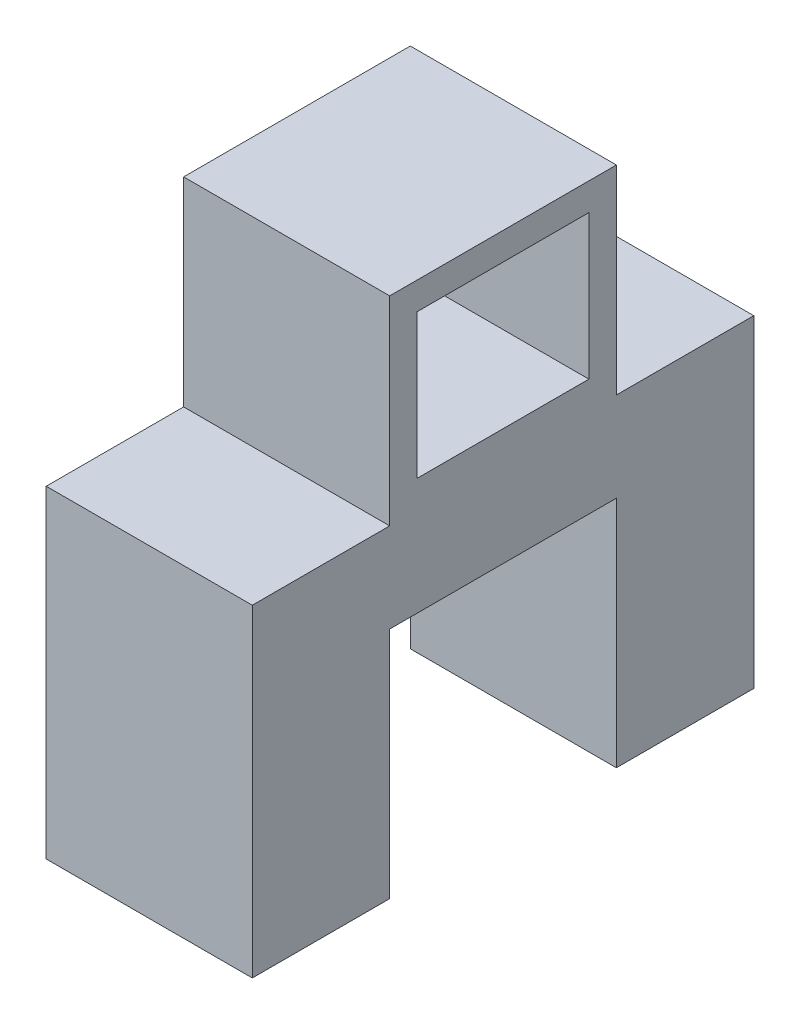
ISO-10303-21;
HEADER;
FILE_DESCRIPTION(('STEP AP214'),'2;1');
FILE_NAME('part.step','',(''),(''),'','','');
FILE_SCHEMA(('AUTOMOTIVE_DESIGN { 1 0 10303 214 1 1 1 1 }'));
ENDSEC;
DATA;
#1=APPLICATION_CONTEXT('core data for automotive mechanical design processes');
#2=APPLICATION_PROTOCOL_DEFINITION('international standard','automotive_design',2000,#1);
#3=PRODUCT_CONTEXT('',#1,'mechanical');
#4=PRODUCT('Part','Part','',(#3));
#5=PRODUCT_RELATED_PRODUCT_CATEGORY('part','',(#4));
#6=PRODUCT_DEFINITION_FORMATION('','',#4);
#7=PRODUCT_DEFINITION_CONTEXT('part definition',#1,'design');
#8=PRODUCT_DEFINITION('design','',#6,#7);
#9=PRODUCT_DEFINITION_SHAPE('','',#8);
#10=(LENGTH_UNIT() NAMED_UNIT(*) SI_UNIT(.MILLI.,.METRE.));
#11=(NAMED_UNIT(*) PLANE_ANGLE_UNIT() SI_UNIT($,.RADIAN.));
#12=(NAMED_UNIT(*) SI_UNIT($,.STERADIAN.) SOLID_ANGLE_UNIT());
#13=UNCERTAINTY_MEASURE_WITH_UNIT(LENGTH_MEASURE(1.E-05),#10,'distance_accuracy_value','');
#14=(GEOMETRIC_REPRESENTATION_CONTEXT(3) GLOBAL_UNCERTAINTY_ASSIGNED_CONTEXT((#13)) GLOBAL_UNIT_ASSIGNED_CONTEXT((#10,
#11,#12)) REPRESENTATION_CONTEXT('',''));
#15=CARTESIAN_POINT('',(0.,0.,0.));
#16=DIRECTION('',(0.,0.,1.));
#17=DIRECTION('',(1.,0.,0.));
#18=AXIS2_PLACEMENT_3D('',#15,#16,#17);
#19=CARTESIAN_POINT('',(15.,0.,0.));
#20=DIRECTION('',(-1.,0.,0.));
#21=DIRECTION('',(0.,0.,1.));
#22=AXIS2_PLACEMENT_3D('',#19,#20,#21);
#23=PLANE('',#22);
#24=DIRECTION('',(0.,0.,1.));
#25=VECTOR('',#24,1.);
#26=CARTESIAN_POINT('',(15.,2.,2.));
#27=LINE('',#26,#25);
#28=CARTESIAN_POINT('',(15.,2.,-14.5));
#29=VERTEX_POINT('',#28);
#30=CARTESIAN_POINT('',(15.,2.,2.));
#31=VERTEX_POINT('',#30);
#32=EDGE_CURVE('E201',#29,#31,#27,.T.);
#33=ORIENTED_EDGE('',*,*,#32,.T.);
#34=DIRECTION('',(0.,-1.,0.));
#35=VECTOR('',#34,1.);
#36=CARTESIAN_POINT('',(15.,2.,2.));
#37=LINE('',#36,#35);
#38=CARTESIAN_POINT('',(15.,-12.5,2.));
#39=VERTEX_POINT('',#38);
#40=EDGE_CURVE('E205',#31,#39,#37,.T.);
#41=ORIENTED_EDGE('',*,*,#40,.T.);
#42=DIRECTION('',(0.,0.,1.));
#43=VECTOR('',#42,1.);
#44=CARTESIAN_POINT('',(15.,-12.5,2.));
#45=LINE('',#44,#43);
#46=CARTESIAN_POINT('',(15.,-12.5,12.));
#47=VERTEX_POINT('',#46);
#48=EDGE_CURVE('E209',#39,#47,#45,.T.);
#49=ORIENTED_EDGE('',*,*,#48,.T.);
#50=DIRECTION('',(0.,-1.,0.));
#51=VECTOR('',#50,1.);
#52=CARTESIAN_POINT('',(15.,-12.5,12.));
#53=LINE('',#52,#51);
#54=CARTESIAN_POINT('',(15.,-36.,12.));
#55=VERTEX_POINT('',#54);
#56=EDGE_CURVE('E212',#47,#55,#53,.T.);
#57=ORIENTED_EDGE('',*,*,#56,.T.);
#58=DIRECTION('',(0.,0.,-1.));
#59=VECTOR('',#58,1.);
#60=CARTESIAN_POINT('',(15.,-36.,12.));
#61=LINE('',#60,#59);
#62=CARTESIAN_POINT('',(15.,-36.,2.));
#63=VERTEX_POINT('',#62);
#64=EDGE_CURVE('E215',#55,#63,#61,.T.);
#65=ORIENTED_EDGE('',*,*,#64,.T.);
#66=DIRECTION('',(0.,1.,0.));
#67=VECTOR('',#66,1.);
#68=CARTESIAN_POINT('',(15.,-36.,2.));
#69=LINE('',#68,#67);
#70=CARTESIAN_POINT('',(15.,-19.0033817942634,2.));
#71=VERTEX_POINT('',#70);
#72=EDGE_CURVE('E218',#63,#71,#69,.T.);
#73=ORIENTED_EDGE('',*,*,#72,.T.);
#74=DIRECTION('',(0.,0.,-1.));
#75=VECTOR('',#74,1.);
#76=CARTESIAN_POINT('',(15.,-19.0033817942634,2.));
#77=LINE('',#76,#75);
#78=CARTESIAN_POINT('',(15.,-19.0033817942634,-14.5));
#79=VERTEX_POINT('',#78);
#80=EDGE_CURVE('E221',#71,#79,#77,.T.);
#81=ORIENTED_EDGE('',*,*,#80,.T.);
#82=DIRECTION('',(0.,-1.,0.));
#83=VECTOR('',#82,1.);
#84=CARTESIAN_POINT('',(15.,-19.0033817942634,-14.5));
#85=LINE('',#84,#83);
#86=CARTESIAN_POINT('',(15.,-36.,-14.5));
#87=VERTEX_POINT('',#86);
#88=EDGE_CURVE('E224',#79,#87,#85,.T.);
#89=ORIENTED_EDGE('',*,*,#88,.T.);
#90=DIRECTION('',(0.,0.,-1.));
#91=VECTOR('',#90,1.);
#92=CARTESIAN_POINT('',(15.,-36.,-14.5));
#93=LINE('',#92,#91);
#94=CARTESIAN_POINT('',(15.,-36.,-24.5));
#95=VERTEX_POINT('',#94);
#96=EDGE_CURVE('E227',#87,#95,#93,.T.);
#97=ORIENTED_EDGE('',*,*,#96,.T.);
#98=DIRECTION('',(0.,1.,0.));
#99=VECTOR('',#98,1.);
#100=CARTESIAN_POINT('',(15.,-12.5,-24.5));
#101=LINE('',#100,#99);
#102=CARTESIAN_POINT('',(15.,-12.5,-24.5));
#103=VERTEX_POINT('',#102);
#104=EDGE_CURVE('E230',#95,#103,#101,.T.);
#105=ORIENTED_EDGE('',*,*,#104,.T.);
#106=DIRECTION('',(0.,0.,1.));
#107=VECTOR('',#106,1.);
#108=CARTESIAN_POINT('',(15.,-12.5,-14.5));
#109=LINE('',#108,#107);
#110=CARTESIAN_POINT('',(15.,-12.5,-14.5));
#111=VERTEX_POINT('',#110);
#112=EDGE_CURVE('E233',#103,#111,#109,.T.);
#113=ORIENTED_EDGE('',*,*,#112,.T.);
#114=DIRECTION('',(0.,1.,0.));
#115=VECTOR('',#114,1.);
#116=CARTESIAN_POINT('',(15.,2.,-14.5));
#117=LINE('',#116,#115);
#118=EDGE_CURVE('E236',#111,#29,#117,.T.);
#119=ORIENTED_EDGE('',*,*,#118,.T.);
#120=EDGE_LOOP('',(#33,#41,#49,#57,#65,#73,#81,#89,#97,#105,#113,#119));
#121=FACE_BOUND('',#120,.T.);
#122=DIRECTION('',(0.,-1.,0.));
#123=VECTOR('',#122,1.);
#124=CARTESIAN_POINT('',(15.,0.,0.));
#125=LINE('',#124,#123);
#126=CARTESIAN_POINT('',(15.,0.,0.));
#127=VERTEX_POINT('',#126);
#128=CARTESIAN_POINT('',(15.,-10.5,0.));
#129=VERTEX_POINT('',#128);
#130=EDGE_CURVE('E153',#127,#129,#125,.T.);
#131=ORIENTED_EDGE('',*,*,#130,.F.);
#132=DIRECTION('',(0.,0.,1.));
#133=VECTOR('',#132,1.);
#134=CARTESIAN_POINT('',(15.,0.,0.));
#135=LINE('',#134,#133);
#136=CARTESIAN_POINT('',(15.,0.,-12.5));
#137=VERTEX_POINT('',#136);
#138=EDGE_CURVE('E179',#137,#127,#135,.T.);
#139=ORIENTED_EDGE('',*,*,#138,.F.);
#140=DIRECTION('',(0.,1.,0.));
#141=VECTOR('',#140,1.);
#142=CARTESIAN_POINT('',(15.,0.,-12.5));
#143=LINE('',#142,#141);
#144=CARTESIAN_POINT('',(15.,-10.5,-12.5));
#145=VERTEX_POINT('',#144);
#146=EDGE_CURVE('E175',#145,#137,#143,.T.);
#147=ORIENTED_EDGE('',*,*,#146,.F.);
#148=DIRECTION('',(0.,0.,-1.));
#149=VECTOR('',#148,1.);
#150=CARTESIAN_POINT('',(15.,-10.5,0.));
#151=LINE('',#150,#149);
#152=EDGE_CURVE('E162',#129,#145,#151,.T.);
#153=ORIENTED_EDGE('',*,*,#152,.F.);
#154=EDGE_LOOP('',(#131,#139,#147,#153));
#155=FACE_BOUND('',#154,.T.);
#156=ADVANCED_FACE('F39',(#121,#155),#23,.F.);
#157=CARTESIAN_POINT('',(0.,0.,0.));
#158=DIRECTION('',(-1.,0.,0.));
#159=DIRECTION('',(0.,0.,1.));
#160=AXIS2_PLACEMENT_3D('',#157,#158,#159);
#161=PLANE('',#160);
#162=DIRECTION('',(0.,0.,1.));
#163=VECTOR('',#162,1.);
#164=CARTESIAN_POINT('',(0.,2.,2.));
#165=LINE('',#164,#163);
#166=CARTESIAN_POINT('',(0.,2.,-14.5));
#167=VERTEX_POINT('',#166);
#168=CARTESIAN_POINT('',(0.,2.,2.));
#169=VERTEX_POINT('',#168);
#170=EDGE_CURVE('E171',#167,#169,#165,.T.);
#171=ORIENTED_EDGE('',*,*,#170,.F.);
#172=DIRECTION('',(0.,1.,0.));
#173=VECTOR('',#172,1.);
#174=CARTESIAN_POINT('',(0.,2.,-14.5));
#175=LINE('',#174,#173);
#176=CARTESIAN_POINT('',(0.,-12.5,-14.5));
#177=VERTEX_POINT('',#176);
#178=EDGE_CURVE('E206',#177,#167,#175,.T.);
#179=ORIENTED_EDGE('',*,*,#178,.F.);
#180=DIRECTION('',(0.,0.,1.));
#181=VECTOR('',#180,1.);
#182=CARTESIAN_POINT('',(0.,-12.5,-14.5));
#183=LINE('',#182,#181);
#184=CARTESIAN_POINT('',(0.,-12.5,-24.5));
#185=VERTEX_POINT('',#184);
#186=EDGE_CURVE('E270',#185,#177,#183,.T.);
#187=ORIENTED_EDGE('',*,*,#186,.F.);
#188=DIRECTION('',(0.,1.,0.));
#189=VECTOR('',#188,1.);
#190=CARTESIAN_POINT('',(0.,-12.5,-24.5));
#191=LINE('',#190,#189);
#192=CARTESIAN_POINT('',(0.,-36.,-24.5));
#193=VERTEX_POINT('',#192);
#194=EDGE_CURVE('E267',#193,#185,#191,.T.);
#195=ORIENTED_EDGE('',*,*,#194,.F.);
#196=DIRECTION('',(0.,0.,-1.));
#197=VECTOR('',#196,1.);
#198=CARTESIAN_POINT('',(0.,-36.,-14.5));
#199=LINE('',#198,#197);
#200=CARTESIAN_POINT('',(0.,-36.,-14.5));
#201=VERTEX_POINT('',#200);
#202=EDGE_CURVE('E264',#201,#193,#199,.T.);
#203=ORIENTED_EDGE('',*,*,#202,.F.);
#204=DIRECTION('',(0.,-1.,0.));
#205=VECTOR('',#204,1.);
#206=CARTESIAN_POINT('',(0.,-19.0033817942634,-14.5));
#207=LINE('',#206,#205);
#208=CARTESIAN_POINT('',(0.,-19.0033817942634,-14.5));
#209=VERTEX_POINT('',#208);
#210=EDGE_CURVE('E261',#209,#201,#207,.T.);
#211=ORIENTED_EDGE('',*,*,#210,.F.);
#212=DIRECTION('',(0.,0.,-1.));
#213=VECTOR('',#212,1.);
#214=CARTESIAN_POINT('',(0.,-19.0033817942634,2.));
#215=LINE('',#214,#213);
#216=CARTESIAN_POINT('',(0.,-19.0033817942634,2.));
#217=VERTEX_POINT('',#216);
#218=EDGE_CURVE('E258',#217,#209,#215,.T.);
#219=ORIENTED_EDGE('',*,*,#218,.F.);
#220=DIRECTION('',(0.,1.,0.));
#221=VECTOR('',#220,1.);
#222=CARTESIAN_POINT('',(0.,-36.,2.));
#223=LINE('',#222,#221);
#224=CARTESIAN_POINT('',(0.,-36.,2.));
#225=VERTEX_POINT('',#224);
#226=EDGE_CURVE('E255',#225,#217,#223,.T.);
#227=ORIENTED_EDGE('',*,*,#226,.F.);
#228=DIRECTION('',(0.,0.,-1.));
#229=VECTOR('',#228,1.);
#230=CARTESIAN_POINT('',(0.,-36.,12.));
#231=LINE('',#230,#229);
#232=CARTESIAN_POINT('',(0.,-36.,12.));
#233=VERTEX_POINT('',#232);
#234=EDGE_CURVE('E252',#233,#225,#231,.T.);
#235=ORIENTED_EDGE('',*,*,#234,.F.);
#236=DIRECTION('',(0.,-1.,0.));
#237=VECTOR('',#236,1.);
#238=CARTESIAN_POINT('',(0.,-12.5,12.));
#239=LINE('',#238,#237);
#240=CARTESIAN_POINT('',(0.,-12.5,12.));
#241=VERTEX_POINT('',#240);
#242=EDGE_CURVE('E249',#241,#233,#239,.T.);
#243=ORIENTED_EDGE('',*,*,#242,.F.);
#244=DIRECTION('',(0.,0.,1.));
#245=VECTOR('',#244,1.);
#246=CARTESIAN_POINT('',(0.,-12.5,2.));
#247=LINE('',#246,#245);
#248=CARTESIAN_POINT('',(0.,-12.5,2.));
#249=VERTEX_POINT('',#248);
#250=EDGE_CURVE('E246',#249,#241,#247,.T.);
#251=ORIENTED_EDGE('',*,*,#250,.F.);
#252=DIRECTION('',(0.,-1.,0.));
#253=VECTOR('',#252,1.);
#254=CARTESIAN_POINT('',(0.,2.,2.));
#255=LINE('',#254,#253);
#256=EDGE_CURVE('E243',#169,#249,#255,.T.);
#257=ORIENTED_EDGE('',*,*,#256,.F.);
#258=EDGE_LOOP('',(#171,#179,#187,#195,#203,#211,#219,#227,#235,#243,#251,#257));
#259=FACE_BOUND('',#258,.T.);
#260=DIRECTION('',(0.,0.,1.));
#261=VECTOR('',#260,1.);
#262=CARTESIAN_POINT('',(0.,0.,0.));
#263=LINE('',#262,#261);
#264=CARTESIAN_POINT('',(0.,0.,-12.5));
#265=VERTEX_POINT('',#264);
#266=CARTESIAN_POINT('',(0.,0.,0.));
#267=VERTEX_POINT('',#266);
#268=EDGE_CURVE('E163',#265,#267,#263,.T.);
#269=ORIENTED_EDGE('',*,*,#268,.T.);
#270=DIRECTION('',(0.,-1.,0.));
#271=VECTOR('',#270,1.);
#272=CARTESIAN_POINT('',(0.,0.,0.));
#273=LINE('',#272,#271);
#274=CARTESIAN_POINT('',(0.,-10.5,0.));
#275=VERTEX_POINT('',#274);
#276=EDGE_CURVE('E63',#267,#275,#273,.T.);
#277=ORIENTED_EDGE('',*,*,#276,.T.);
#278=DIRECTION('',(0.,0.,-1.));
#279=VECTOR('',#278,1.);
#280=CARTESIAN_POINT('',(0.,-10.5,0.));
#281=LINE('',#280,#279);
#282=CARTESIAN_POINT('',(0.,-10.5,-12.5));
#283=VERTEX_POINT('',#282);
#284=EDGE_CURVE('E169',#275,#283,#281,.T.);
#285=ORIENTED_EDGE('',*,*,#284,.T.);
#286=DIRECTION('',(0.,1.,0.));
#287=VECTOR('',#286,1.);
#288=CARTESIAN_POINT('',(0.,0.,-12.5));
#289=LINE('',#288,#287);
#290=EDGE_CURVE('E188',#283,#265,#289,.T.);
#291=ORIENTED_EDGE('',*,*,#290,.T.);
#292=EDGE_LOOP('',(#269,#277,#285,#291));
#293=FACE_BOUND('',#292,.T.);
#294=ADVANCED_FACE('F325',(#259,#293),#161,.T.);
#295=CARTESIAN_POINT('',(15.,2.,2.));
#296=DIRECTION('',(0.,-1.,0.));
#297=DIRECTION('',(0.,0.,-1.));
#298=AXIS2_PLACEMENT_3D('',#295,#296,#297);
#299=PLANE('',#298);
#300=ORIENTED_EDGE('',*,*,#170,.T.);
#301=DIRECTION('',(-1.,0.,0.));
#302=VECTOR('',#301,1.);
#303=CARTESIAN_POINT('',(15.,2.,2.));
#304=LINE('',#303,#302);
#305=EDGE_CURVE('E11',#31,#169,#304,.T.);
#306=ORIENTED_EDGE('',*,*,#305,.F.);
#307=ORIENTED_EDGE('',*,*,#32,.F.);
#308=DIRECTION('',(-1.,0.,0.));
#309=VECTOR('',#308,1.);
#310=CARTESIAN_POINT('',(15.,2.,-14.5));
#311=LINE('',#310,#309);
#312=EDGE_CURVE('E239',#29,#167,#311,.T.);
#313=ORIENTED_EDGE('',*,*,#312,.T.);
#314=EDGE_LOOP('',(#300,#306,#307,#313));
#315=FACE_BOUND('',#314,.T.);
#316=ADVANCED_FACE('F41',(#315),#299,.F.);
#317=CARTESIAN_POINT('',(15.,2.,2.));
#318=DIRECTION('',(0.,0.,-1.));
#319=DIRECTION('',(-1.,0.,0.));
#320=AXIS2_PLACEMENT_3D('',#317,#318,#319);
#321=PLANE('',#320);
#322=ORIENTED_EDGE('',*,*,#256,.T.);
#323=DIRECTION('',(-1.,0.,0.));
#324=VECTOR('',#323,1.);
#325=CARTESIAN_POINT('',(15.,-12.5,2.));
#326=LINE('',#325,#324);
#327=EDGE_CURVE('E48',#39,#249,#326,.T.);
#328=ORIENTED_EDGE('',*,*,#327,.F.);
#329=ORIENTED_EDGE('',*,*,#40,.F.);
#330=ORIENTED_EDGE('',*,*,#305,.T.);
#331=EDGE_LOOP('',(#322,#328,#329,#330));
#332=FACE_BOUND('',#331,.T.);
#333=ADVANCED_FACE('F342',(#332),#321,.F.);
#334=CARTESIAN_POINT('',(15.,-12.5,2.));
#335=DIRECTION('',(0.,-1.,0.));
#336=DIRECTION('',(0.,0.,-1.));
#337=AXIS2_PLACEMENT_3D('',#334,#335,#336);
#338=PLANE('',#337);
#339=ORIENTED_EDGE('',*,*,#250,.T.);
#340=DIRECTION('',(-1.,0.,0.));
#341=VECTOR('',#340,1.);
#342=CARTESIAN_POINT('',(15.,-12.5,12.));
#343=LINE('',#342,#341);
#344=EDGE_CURVE('E310',#47,#241,#343,.T.);
#345=ORIENTED_EDGE('',*,*,#344,.F.);
#346=ORIENTED_EDGE('',*,*,#48,.F.);
#347=ORIENTED_EDGE('',*,*,#327,.T.);
#348=EDGE_LOOP('',(#339,#345,#346,#347));
#349=FACE_BOUND('',#348,.T.);
#350=ADVANCED_FACE('F319',(#349),#338,.F.);
#351=CARTESIAN_POINT('',(15.,-12.5,12.));
#352=DIRECTION('',(0.,0.,-1.));
#353=DIRECTION('',(0.,1.,0.));
#354=AXIS2_PLACEMENT_3D('',#351,#352,#353);
#355=PLANE('',#354);
#356=ORIENTED_EDGE('',*,*,#242,.T.);
#357=DIRECTION('',(-1.,0.,0.));
#358=VECTOR('',#357,1.);
#359=CARTESIAN_POINT('',(15.,-36.,12.));
#360=LINE('',#359,#358);
#361=EDGE_CURVE('E306',#55,#233,#360,.T.);
#362=ORIENTED_EDGE('',*,*,#361,.F.);
#363=ORIENTED_EDGE('',*,*,#56,.F.);
#364=ORIENTED_EDGE('',*,*,#344,.T.);
#365=EDGE_LOOP('',(#356,#362,#363,#364));
#366=FACE_BOUND('',#365,.T.);
#367=ADVANCED_FACE('F331',(#366),#355,.F.);
#368=CARTESIAN_POINT('',(15.,-36.,12.));
#369=DIRECTION('',(0.,1.,0.));
#370=DIRECTION('',(0.,0.,1.));
#371=AXIS2_PLACEMENT_3D('',#368,#369,#370);
#372=PLANE('',#371);
#373=ORIENTED_EDGE('',*,*,#234,.T.);
#374=DIRECTION('',(-1.,0.,0.));
#375=VECTOR('',#374,1.);
#376=CARTESIAN_POINT('',(15.,-36.,2.));
#377=LINE('',#376,#375);
#378=EDGE_CURVE('E302',#63,#225,#377,.T.);
#379=ORIENTED_EDGE('',*,*,#378,.F.);
#380=ORIENTED_EDGE('',*,*,#64,.F.);
#381=ORIENTED_EDGE('',*,*,#361,.T.);
#382=EDGE_LOOP('',(#373,#379,#380,#381));
#383=FACE_BOUND('',#382,.T.);
#384=ADVANCED_FACE('F335',(#383),#372,.F.);
#385=CARTESIAN_POINT('',(15.,-36.,2.));
#386=DIRECTION('',(0.,0.,1.));
#387=DIRECTION('',(0.,-1.,0.));
#388=AXIS2_PLACEMENT_3D('',#385,#386,#387);
#389=PLANE('',#388);
#390=ORIENTED_EDGE('',*,*,#226,.T.);
#391=DIRECTION('',(-1.,0.,0.));
#392=VECTOR('',#391,1.);
#393=CARTESIAN_POINT('',(15.,-19.0033817942634,2.));
#394=LINE('',#393,#392);
#395=EDGE_CURVE('E298',#71,#217,#394,.T.);
#396=ORIENTED_EDGE('',*,*,#395,.F.);
#397=ORIENTED_EDGE('',*,*,#72,.F.);
#398=ORIENTED_EDGE('',*,*,#378,.T.);
#399=EDGE_LOOP('',(#390,#396,#397,#398));
#400=FACE_BOUND('',#399,.T.);
#401=ADVANCED_FACE('F375',(#400),#389,.F.);
#402=CARTESIAN_POINT('',(15.,-19.0033817942634,2.));
#403=DIRECTION('',(0.,1.,0.));
#404=DIRECTION('',(0.,0.,1.));
#405=AXIS2_PLACEMENT_3D('',#402,#403,#404);
#406=PLANE('',#405);
#407=ORIENTED_EDGE('',*,*,#218,.T.);
#408=DIRECTION('',(-1.,0.,0.));
#409=VECTOR('',#408,1.);
#410=CARTESIAN_POINT('',(15.,-19.0033817942634,-14.5));
#411=LINE('',#410,#409);
#412=EDGE_CURVE('E294',#79,#209,#411,.T.);
#413=ORIENTED_EDGE('',*,*,#412,.F.);
#414=ORIENTED_EDGE('',*,*,#80,.F.);
#415=ORIENTED_EDGE('',*,*,#395,.T.);
#416=EDGE_LOOP('',(#407,#413,#414,#415));
#417=FACE_BOUND('',#416,.T.);
#418=ADVANCED_FACE('F373',(#417),#406,.F.);
#419=CARTESIAN_POINT('',(15.,-19.0033817942634,-14.5));
#420=DIRECTION('',(0.,0.,-1.));
#421=DIRECTION('',(-1.,0.,0.));
#422=AXIS2_PLACEMENT_3D('',#419,#420,#421);
#423=PLANE('',#422);
#424=ORIENTED_EDGE('',*,*,#210,.T.);
#425=DIRECTION('',(-1.,0.,0.));
#426=VECTOR('',#425,1.);
#427=CARTESIAN_POINT('',(15.,-36.,-14.5));
#428=LINE('',#427,#426);
#429=EDGE_CURVE('E290',#87,#201,#428,.T.);
#430=ORIENTED_EDGE('',*,*,#429,.F.);
#431=ORIENTED_EDGE('',*,*,#88,.F.);
#432=ORIENTED_EDGE('',*,*,#412,.T.);
#433=EDGE_LOOP('',(#424,#430,#431,#432));
#434=FACE_BOUND('',#433,.T.);
#435=ADVANCED_FACE('F369',(#434),#423,.F.);
#436=CARTESIAN_POINT('',(15.,-36.,-14.5));
#437=DIRECTION('',(0.,1.,0.));
#438=DIRECTION('',(0.,0.,1.));
#439=AXIS2_PLACEMENT_3D('',#436,#437,#438);
#440=PLANE('',#439);
#441=ORIENTED_EDGE('',*,*,#202,.T.);
#442=DIRECTION('',(-1.,0.,0.));
#443=VECTOR('',#442,1.);
#444=CARTESIAN_POINT('',(15.,-36.,-24.5));
#445=LINE('',#444,#443);
#446=EDGE_CURVE('E286',#95,#193,#445,.T.);
#447=ORIENTED_EDGE('',*,*,#446,.F.);
#448=ORIENTED_EDGE('',*,*,#96,.F.);
#449=ORIENTED_EDGE('',*,*,#429,.T.);
#450=EDGE_LOOP('',(#441,#447,#448,#449));
#451=FACE_BOUND('',#450,.T.);
#452=ADVANCED_FACE('F364',(#451),#440,.F.);
#453=CARTESIAN_POINT('',(15.,-12.5,-24.5));
#454=DIRECTION('',(0.,0.,1.));
#455=DIRECTION('',(1.,0.,0.));
#456=AXIS2_PLACEMENT_3D('',#453,#454,#455);
#457=PLANE('',#456);
#458=ORIENTED_EDGE('',*,*,#194,.T.);
#459=DIRECTION('',(-1.,0.,0.));
#460=VECTOR('',#459,1.);
#461=CARTESIAN_POINT('',(15.,-12.5,-24.5));
#462=LINE('',#461,#460);
#463=EDGE_CURVE('E282',#103,#185,#462,.T.);
#464=ORIENTED_EDGE('',*,*,#463,.F.);
#465=ORIENTED_EDGE('',*,*,#104,.F.);
#466=ORIENTED_EDGE('',*,*,#446,.T.);
#467=EDGE_LOOP('',(#458,#464,#465,#466));
#468=FACE_BOUND('',#467,.T.);
#469=ADVANCED_FACE('F358',(#468),#457,.F.);
#470=CARTESIAN_POINT('',(15.,-12.5,-14.5));
#471=DIRECTION('',(0.,-1.,0.));
#472=DIRECTION('',(0.,0.,-1.));
#473=AXIS2_PLACEMENT_3D('',#470,#471,#472);
#474=PLANE('',#473);
#475=ORIENTED_EDGE('',*,*,#186,.T.);
#476=DIRECTION('',(-1.,0.,0.));
#477=VECTOR('',#476,1.);
#478=CARTESIAN_POINT('',(15.,-12.5,-14.5));
#479=LINE('',#478,#477);
#480=EDGE_CURVE('E278',#111,#177,#479,.T.);
#481=ORIENTED_EDGE('',*,*,#480,.F.);
#482=ORIENTED_EDGE('',*,*,#112,.F.);
#483=ORIENTED_EDGE('',*,*,#463,.T.);
#484=EDGE_LOOP('',(#475,#481,#482,#483));
#485=FACE_BOUND('',#484,.T.);
#486=ADVANCED_FACE('F354',(#485),#474,.F.);
#487=CARTESIAN_POINT('',(15.,2.,-14.5));
#488=DIRECTION('',(0.,0.,1.));
#489=DIRECTION('',(1.,0.,0.));
#490=AXIS2_PLACEMENT_3D('',#487,#488,#489);
#491=PLANE('',#490);
#492=ORIENTED_EDGE('',*,*,#178,.T.);
#493=ORIENTED_EDGE('',*,*,#312,.F.);
#494=ORIENTED_EDGE('',*,*,#118,.F.);
#495=ORIENTED_EDGE('',*,*,#480,.T.);
#496=EDGE_LOOP('',(#492,#493,#494,#495));
#497=FACE_BOUND('',#496,.T.);
#498=ADVANCED_FACE('F349',(#497),#491,.F.);
#499=CARTESIAN_POINT('',(15.,0.,0.));
#500=DIRECTION('',(0.,0.,-1.));
#501=DIRECTION('',(0.,1.,0.));
#502=AXIS2_PLACEMENT_3D('',#499,#500,#501);
#503=PLANE('',#502);
#504=ORIENTED_EDGE('',*,*,#276,.F.);
#505=DIRECTION('',(-1.,0.,0.));
#506=VECTOR('',#505,1.);
#507=CARTESIAN_POINT('',(15.,0.,0.));
#508=LINE('',#507,#506);
#509=EDGE_CURVE('E157',#127,#267,#508,.T.);
#510=ORIENTED_EDGE('',*,*,#509,.F.);
#511=ORIENTED_EDGE('',*,*,#130,.T.);
#512=DIRECTION('',(-1.,0.,0.));
#513=VECTOR('',#512,1.);
#514=CARTESIAN_POINT('',(15.,-10.5,0.));
#515=LINE('',#514,#513);
#516=EDGE_CURVE('E156',#129,#275,#515,.T.);
#517=ORIENTED_EDGE('',*,*,#516,.T.);
#518=EDGE_LOOP('',(#504,#510,#511,#517));
#519=FACE_BOUND('',#518,.T.);
#520=ADVANCED_FACE('F155',(#519),#503,.T.);
#521=CARTESIAN_POINT('',(15.,-10.5,0.));
#522=DIRECTION('',(0.,1.,0.));
#523=DIRECTION('',(0.,0.,1.));
#524=AXIS2_PLACEMENT_3D('',#521,#522,#523);
#525=PLANE('',#524);
#526=ORIENTED_EDGE('',*,*,#284,.F.);
#527=ORIENTED_EDGE('',*,*,#516,.F.);
#528=ORIENTED_EDGE('',*,*,#152,.T.);
#529=DIRECTION('',(-1.,0.,0.));
#530=VECTOR('',#529,1.);
#531=CARTESIAN_POINT('',(15.,-10.5,-12.5));
#532=LINE('',#531,#530);
#533=EDGE_CURVE('E172',#145,#283,#532,.T.);
#534=ORIENTED_EDGE('',*,*,#533,.T.);
#535=EDGE_LOOP('',(#526,#527,#528,#534));
#536=FACE_BOUND('',#535,.T.);
#537=ADVANCED_FACE('F166',(#536),#525,.T.);
#538=CARTESIAN_POINT('',(15.,0.,-12.5));
#539=DIRECTION('',(0.,0.,1.));
#540=DIRECTION('',(0.,-1.,0.));
#541=AXIS2_PLACEMENT_3D('',#538,#539,#540);
#542=PLANE('',#541);
#543=ORIENTED_EDGE('',*,*,#290,.F.);
#544=ORIENTED_EDGE('',*,*,#533,.F.);
#545=ORIENTED_EDGE('',*,*,#146,.T.);
#546=DIRECTION('',(-1.,0.,0.));
#547=VECTOR('',#546,1.);
#548=CARTESIAN_POINT('',(15.,0.,-12.5));
#549=LINE('',#548,#547);
#550=EDGE_CURVE('E55',#137,#265,#549,.T.);
#551=ORIENTED_EDGE('',*,*,#550,.T.);
#552=EDGE_LOOP('',(#543,#544,#545,#551));
#553=FACE_BOUND('',#552,.T.);
#554=ADVANCED_FACE('F433',(#553),#542,.T.);
#555=CARTESIAN_POINT('',(15.,0.,0.));
#556=DIRECTION('',(0.,-1.,0.));
#557=DIRECTION('',(0.,0.,-1.));
#558=AXIS2_PLACEMENT_3D('',#555,#556,#557);
#559=PLANE('',#558);
#560=ORIENTED_EDGE('',*,*,#268,.F.);
#561=ORIENTED_EDGE('',*,*,#550,.F.);
#562=ORIENTED_EDGE('',*,*,#138,.T.);
#563=ORIENTED_EDGE('',*,*,#509,.T.);
#564=EDGE_LOOP('',(#560,#561,#562,#563));
#565=FACE_BOUND('',#564,.T.);
#566=ADVANCED_FACE('F439',(#565),#559,.T.);
#567=CLOSED_SHELL('',(#156,#294,#316,#333,#350,#367,#384,#401,#418,#435,#452,#469,#486,#498,
#520,#537,#554,#566));
#568=MANIFOLD_SOLID_BREP('B2',#567);
#569=ADVANCED_BREP_SHAPE_REPRESENTATION('',(#18,#568),#14);
#570=SHAPE_DEFINITION_REPRESENTATION(#9,#569);
ENDSEC;
END-ISO-10303-21;
